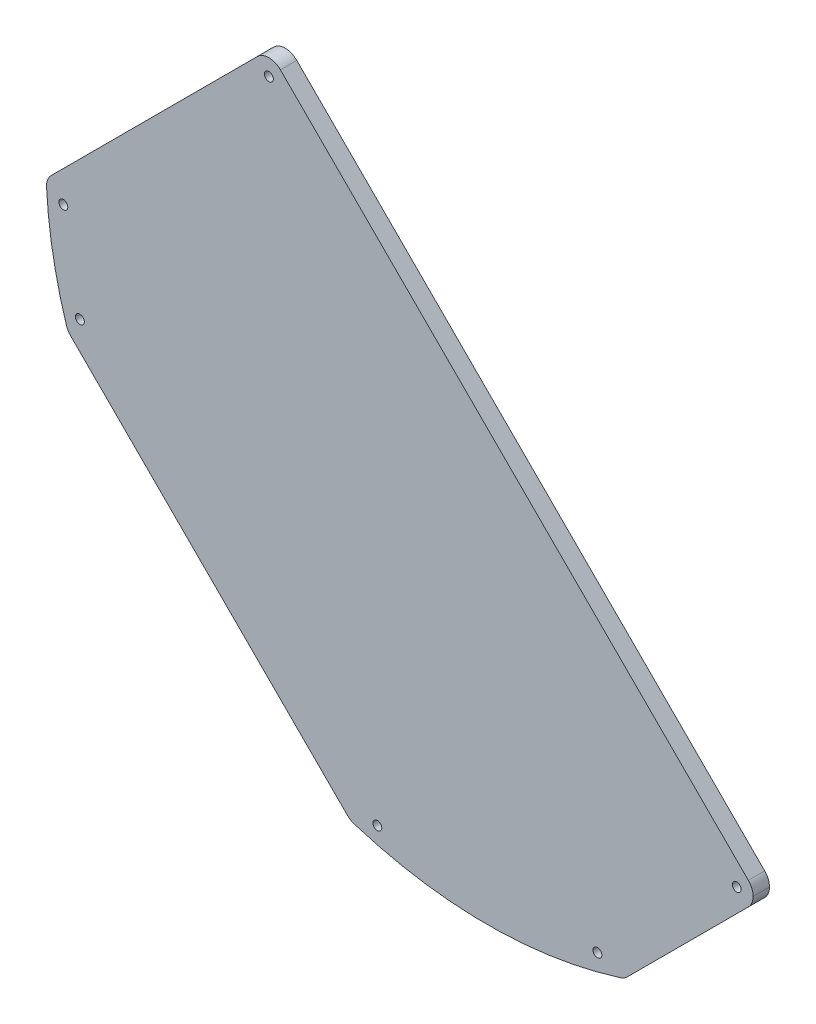
ISO-10303-21;
HEADER;
FILE_DESCRIPTION(('STEP AP214'),'2;1');
FILE_NAME('part.step','',(''),(''),'','','');
FILE_SCHEMA(('AUTOMOTIVE_DESIGN { 1 0 10303 214 1 1 1 1 }'));
ENDSEC;
DATA;
#1=APPLICATION_CONTEXT('core data for automotive mechanical design processes');
#2=APPLICATION_PROTOCOL_DEFINITION('international standard','automotive_design',2000,#1);
#3=PRODUCT_CONTEXT('',#1,'mechanical');
#4=PRODUCT('Part','Part','',(#3));
#5=PRODUCT_RELATED_PRODUCT_CATEGORY('part','',(#4));
#6=PRODUCT_DEFINITION_FORMATION('','',#4);
#7=PRODUCT_DEFINITION_CONTEXT('part definition',#1,'design');
#8=PRODUCT_DEFINITION('design','',#6,#7);
#9=PRODUCT_DEFINITION_SHAPE('','',#8);
#10=(LENGTH_UNIT() NAMED_UNIT(*) SI_UNIT(.MILLI.,.METRE.));
#11=(NAMED_UNIT(*) PLANE_ANGLE_UNIT() SI_UNIT($,.RADIAN.));
#12=(NAMED_UNIT(*) SI_UNIT($,.STERADIAN.) SOLID_ANGLE_UNIT());
#13=UNCERTAINTY_MEASURE_WITH_UNIT(LENGTH_MEASURE(1.E-05),#10,'distance_accuracy_value','');
#14=(GEOMETRIC_REPRESENTATION_CONTEXT(3) GLOBAL_UNCERTAINTY_ASSIGNED_CONTEXT((#13)) GLOBAL_UNIT_ASSIGNED_CONTEXT((#10,
#11,#12)) REPRESENTATION_CONTEXT('',''));
#15=CARTESIAN_POINT('',(0.,0.,0.));
#16=DIRECTION('',(0.,0.,1.));
#17=DIRECTION('',(1.,0.,0.));
#18=AXIS2_PLACEMENT_3D('',#15,#16,#17);
#19=CARTESIAN_POINT('',(-84.8634203441035,71.3930361624998,0.));
#20=DIRECTION('',(0.,0.,-1.));
#21=DIRECTION('',(-1.,0.,0.));
#22=AXIS2_PLACEMENT_3D('',#19,#20,#21);
#23=CYLINDRICAL_SURFACE('',#22,1.7272);
#24=DIRECTION('',(0.,0.,-1.));
#25=VECTOR('',#24,1.);
#26=CARTESIAN_POINT('',(-83.1362203441035,71.3930361624998,0.));
#27=LINE('',#26,#25);
#28=CARTESIAN_POINT('',(-83.1362203441035,71.3930361624998,6.35));
#29=VERTEX_POINT('',#28);
#30=CARTESIAN_POINT('',(-83.1362203441035,71.3930361624998,0.));
#31=VERTEX_POINT('',#30);
#32=EDGE_CURVE('E285',#29,#31,#27,.T.);
#33=ORIENTED_EDGE('',*,*,#32,.F.);
#34=CARTESIAN_POINT('',(-84.8634203441035,71.3930361624998,6.35));
#35=DIRECTION('',(0.,0.,1.));
#36=DIRECTION('',(1.,0.,0.));
#37=AXIS2_PLACEMENT_3D('',#34,#35,#36);
#38=CIRCLE('',#37,1.7272);
#39=CARTESIAN_POINT('',(-86.5906203441035,71.3930361624998,6.35));
#40=VERTEX_POINT('',#39);
#41=EDGE_CURVE('E126',#29,#40,#38,.T.);
#42=ORIENTED_EDGE('',*,*,#41,.T.);
#43=DIRECTION('',(0.,0.,-1.));
#44=VECTOR('',#43,1.);
#45=CARTESIAN_POINT('',(-86.5906203441035,71.3930361624998,0.));
#46=LINE('',#45,#44);
#47=CARTESIAN_POINT('',(-86.5906203441035,71.3930361624998,0.));
#48=VERTEX_POINT('',#47);
#49=EDGE_CURVE('E307',#40,#48,#46,.T.);
#50=ORIENTED_EDGE('',*,*,#49,.T.);
#51=CARTESIAN_POINT('',(-84.8634203441035,71.3930361624998,0.));
#52=DIRECTION('',(0.,0.,-1.));
#53=DIRECTION('',(-1.,0.,0.));
#54=AXIS2_PLACEMENT_3D('',#51,#52,#53);
#55=CIRCLE('',#54,1.7272);
#56=EDGE_CURVE('E233',#48,#31,#55,.T.);
#57=ORIENTED_EDGE('',*,*,#56,.T.);
#58=EDGE_LOOP('',(#33,#42,#50,#57));
#59=FACE_BOUND('',#58,.T.);
#60=ADVANCED_FACE('F15',(#59),#23,.F.);
#61=CARTESIAN_POINT('',(96.879003034094,-110.349387215698,0.));
#62=DIRECTION('',(0.,0.,-1.));
#63=DIRECTION('',(-1.,0.,0.));
#64=AXIS2_PLACEMENT_3D('',#61,#62,#63);
#65=CYLINDRICAL_SURFACE('',#64,1.7272);
#66=DIRECTION('',(0.,0.,-1.));
#67=VECTOR('',#66,1.);
#68=CARTESIAN_POINT('',(98.606203034094,-110.349387215698,0.));
#69=LINE('',#68,#67);
#70=CARTESIAN_POINT('',(98.606203034094,-110.349387215698,6.35));
#71=VERTEX_POINT('',#70);
#72=CARTESIAN_POINT('',(98.606203034094,-110.349387215698,0.));
#73=VERTEX_POINT('',#72);
#74=EDGE_CURVE('E312',#71,#73,#69,.T.);
#75=ORIENTED_EDGE('',*,*,#74,.F.);
#76=CARTESIAN_POINT('',(96.879003034094,-110.349387215698,6.35));
#77=DIRECTION('',(0.,0.,1.));
#78=DIRECTION('',(1.,0.,0.));
#79=AXIS2_PLACEMENT_3D('',#76,#77,#78);
#80=CIRCLE('',#79,1.7272);
#81=CARTESIAN_POINT('',(95.151803034094,-110.349387215698,6.35));
#82=VERTEX_POINT('',#81);
#83=EDGE_CURVE('E125',#71,#82,#80,.T.);
#84=ORIENTED_EDGE('',*,*,#83,.T.);
#85=DIRECTION('',(0.,0.,-1.));
#86=VECTOR('',#85,1.);
#87=CARTESIAN_POINT('',(95.151803034094,-110.349387215698,0.));
#88=LINE('',#87,#86);
#89=CARTESIAN_POINT('',(95.151803034094,-110.349387215698,0.));
#90=VERTEX_POINT('',#89);
#91=EDGE_CURVE('E335',#82,#90,#88,.T.);
#92=ORIENTED_EDGE('',*,*,#91,.T.);
#93=CARTESIAN_POINT('',(96.879003034094,-110.349387215698,0.));
#94=DIRECTION('',(0.,0.,-1.));
#95=DIRECTION('',(-1.,0.,0.));
#96=AXIS2_PLACEMENT_3D('',#93,#94,#95);
#97=CIRCLE('',#96,1.7272);
#98=EDGE_CURVE('E224',#90,#73,#97,.T.);
#99=ORIENTED_EDGE('',*,*,#98,.T.);
#100=EDGE_LOOP('',(#75,#84,#92,#99));
#101=FACE_BOUND('',#100,.T.);
#102=ADVANCED_FACE('F500',(#101),#65,.F.);
#103=CARTESIAN_POINT('',(-164.69199269842,-11.5998940091604,0.));
#104=DIRECTION('',(0.,0.,-1.));
#105=DIRECTION('',(-1.,0.,0.));
#106=AXIS2_PLACEMENT_3D('',#103,#104,#105);
#107=CYLINDRICAL_SURFACE('',#106,1.7272);
#108=DIRECTION('',(0.,0.,-1.));
#109=VECTOR('',#108,1.);
#110=CARTESIAN_POINT('',(-162.964792698419,-11.5998940091604,0.));
#111=LINE('',#110,#109);
#112=CARTESIAN_POINT('',(-162.964792698419,-11.5998940091604,6.35));
#113=VERTEX_POINT('',#112);
#114=CARTESIAN_POINT('',(-162.964792698419,-11.5998940091604,0.));
#115=VERTEX_POINT('',#114);
#116=EDGE_CURVE('E319',#113,#115,#111,.T.);
#117=ORIENTED_EDGE('',*,*,#116,.F.);
#118=CARTESIAN_POINT('',(-164.69199269842,-11.5998940091604,6.35));
#119=DIRECTION('',(0.,0.,1.));
#120=DIRECTION('',(1.,0.,0.));
#121=AXIS2_PLACEMENT_3D('',#118,#119,#120);
#122=CIRCLE('',#121,1.7272);
#123=CARTESIAN_POINT('',(-166.419192698419,-11.5998940091604,6.35));
#124=VERTEX_POINT('',#123);
#125=EDGE_CURVE('E130',#113,#124,#122,.T.);
#126=ORIENTED_EDGE('',*,*,#125,.T.);
#127=DIRECTION('',(0.,0.,-1.));
#128=VECTOR('',#127,1.);
#129=CARTESIAN_POINT('',(-166.419192698419,-11.5998940091604,0.));
#130=LINE('',#129,#128);
#131=CARTESIAN_POINT('',(-166.419192698419,-11.5998940091604,0.));
#132=VERTEX_POINT('',#131);
#133=EDGE_CURVE('E294',#124,#132,#130,.T.);
#134=ORIENTED_EDGE('',*,*,#133,.T.);
#135=CARTESIAN_POINT('',(-164.69199269842,-11.5998940091604,0.));
#136=DIRECTION('',(0.,0.,-1.));
#137=DIRECTION('',(-1.,0.,0.));
#138=AXIS2_PLACEMENT_3D('',#135,#136,#137);
#139=CIRCLE('',#138,1.7272);
#140=EDGE_CURVE('E218',#132,#115,#139,.T.);
#141=ORIENTED_EDGE('',*,*,#140,.T.);
#142=EDGE_LOOP('',(#117,#126,#134,#141));
#143=FACE_BOUND('',#142,.T.);
#144=ADVANCED_FACE('F502',(#143),#107,.F.);
#145=CARTESIAN_POINT('',(-158.277458295027,-46.9708015224995,0.));
#146=DIRECTION('',(0.,0.,-1.));
#147=DIRECTION('',(-1.,0.,0.));
#148=AXIS2_PLACEMENT_3D('',#145,#146,#147);
#149=CYLINDRICAL_SURFACE('',#148,1.7272);
#150=DIRECTION('',(0.,0.,-1.));
#151=VECTOR('',#150,1.);
#152=CARTESIAN_POINT('',(-156.550258295027,-46.9708015224995,0.));
#153=LINE('',#152,#151);
#154=CARTESIAN_POINT('',(-156.550258295027,-46.9708015224995,6.35));
#155=VERTEX_POINT('',#154);
#156=CARTESIAN_POINT('',(-156.550258295027,-46.9708015224995,0.));
#157=VERTEX_POINT('',#156);
#158=EDGE_CURVE('E292',#155,#157,#153,.T.);
#159=ORIENTED_EDGE('',*,*,#158,.F.);
#160=CARTESIAN_POINT('',(-158.277458295027,-46.9708015224995,6.35));
#161=DIRECTION('',(0.,0.,1.));
#162=DIRECTION('',(1.,0.,0.));
#163=AXIS2_PLACEMENT_3D('',#160,#161,#162);
#164=CIRCLE('',#163,1.7272);
#165=CARTESIAN_POINT('',(-160.004658295027,-46.9708015224995,6.35));
#166=VERTEX_POINT('',#165);
#167=EDGE_CURVE('E128',#155,#166,#164,.T.);
#168=ORIENTED_EDGE('',*,*,#167,.T.);
#169=DIRECTION('',(0.,0.,-1.));
#170=VECTOR('',#169,1.);
#171=CARTESIAN_POINT('',(-160.004658295027,-46.9708015224995,0.));
#172=LINE('',#171,#170);
#173=CARTESIAN_POINT('',(-160.004658295027,-46.9708015224995,0.));
#174=VERTEX_POINT('',#173);
#175=EDGE_CURVE('E299',#166,#174,#172,.T.);
#176=ORIENTED_EDGE('',*,*,#175,.T.);
#177=CARTESIAN_POINT('',(-158.277458295027,-46.9708015224995,0.));
#178=DIRECTION('',(0.,0.,-1.));
#179=DIRECTION('',(-1.,0.,0.));
#180=AXIS2_PLACEMENT_3D('',#177,#178,#179);
#181=CIRCLE('',#180,1.7272);
#182=EDGE_CURVE('E210',#174,#157,#181,.T.);
#183=ORIENTED_EDGE('',*,*,#182,.T.);
#184=EDGE_LOOP('',(#159,#168,#176,#183));
#185=FACE_BOUND('',#184,.T.);
#186=ADVANCED_FACE('F825',(#185),#149,.F.);
#187=CARTESIAN_POINT('',(42.7310243464256,-159.474353920325,0.));
#188=DIRECTION('',(0.,0.,-1.));
#189=DIRECTION('',(-1.,0.,0.));
#190=AXIS2_PLACEMENT_3D('',#187,#188,#189);
#191=CYLINDRICAL_SURFACE('',#190,1.7272);
#192=DIRECTION('',(0.,0.,-1.));
#193=VECTOR('',#192,1.);
#194=CARTESIAN_POINT('',(44.4582243464257,-159.474353920325,0.));
#195=LINE('',#194,#193);
#196=CARTESIAN_POINT('',(44.4582243464257,-159.474353920325,6.35));
#197=VERTEX_POINT('',#196);
#198=CARTESIAN_POINT('',(44.4582243464257,-159.474353920325,0.));
#199=VERTEX_POINT('',#198);
#200=EDGE_CURVE('E354',#197,#199,#195,.T.);
#201=ORIENTED_EDGE('',*,*,#200,.F.);
#202=CARTESIAN_POINT('',(42.7310243464256,-159.474353920325,6.35));
#203=DIRECTION('',(0.,0.,1.));
#204=DIRECTION('',(1.,0.,0.));
#205=AXIS2_PLACEMENT_3D('',#202,#203,#204);
#206=CIRCLE('',#205,1.7272);
#207=CARTESIAN_POINT('',(41.0038243464256,-159.474353920325,6.35));
#208=VERTEX_POINT('',#207);
#209=EDGE_CURVE('E135',#197,#208,#206,.T.);
#210=ORIENTED_EDGE('',*,*,#209,.T.);
#211=DIRECTION('',(0.,0.,-1.));
#212=VECTOR('',#211,1.);
#213=CARTESIAN_POINT('',(41.0038243464256,-159.474353920325,0.));
#214=LINE('',#213,#212);
#215=CARTESIAN_POINT('',(41.0038243464256,-159.474353920325,0.));
#216=VERTEX_POINT('',#215);
#217=EDGE_CURVE('E361',#208,#216,#214,.T.);
#218=ORIENTED_EDGE('',*,*,#217,.T.);
#219=CARTESIAN_POINT('',(42.7310243464256,-159.474353920325,0.));
#220=DIRECTION('',(0.,0.,-1.));
#221=DIRECTION('',(-1.,0.,0.));
#222=AXIS2_PLACEMENT_3D('',#219,#220,#221);
#223=CIRCLE('',#222,1.7272);
#224=EDGE_CURVE('E214',#216,#199,#223,.T.);
#225=ORIENTED_EDGE('',*,*,#224,.T.);
#226=EDGE_LOOP('',(#201,#210,#218,#225));
#227=FACE_BOUND('',#226,.T.);
#228=ADVANCED_FACE('F495',(#227),#191,.F.);
#229=CARTESIAN_POINT('',(-42.7310243464257,-159.474353920325,0.));
#230=DIRECTION('',(0.,0.,-1.));
#231=DIRECTION('',(-1.,0.,0.));
#232=AXIS2_PLACEMENT_3D('',#229,#230,#231);
#233=CYLINDRICAL_SURFACE('',#232,1.7272);
#234=DIRECTION('',(0.,0.,-1.));
#235=VECTOR('',#234,1.);
#236=CARTESIAN_POINT('',(-41.0038243464257,-159.474353920325,0.));
#237=LINE('',#236,#235);
#238=CARTESIAN_POINT('',(-41.0038243464257,-159.474353920325,6.35));
#239=VERTEX_POINT('',#238);
#240=CARTESIAN_POINT('',(-41.0038243464257,-159.474353920325,0.));
#241=VERTEX_POINT('',#240);
#242=EDGE_CURVE('E371',#239,#241,#237,.T.);
#243=ORIENTED_EDGE('',*,*,#242,.F.);
#244=CARTESIAN_POINT('',(-42.7310243464257,-159.474353920325,6.35));
#245=DIRECTION('',(0.,0.,1.));
#246=DIRECTION('',(1.,0.,0.));
#247=AXIS2_PLACEMENT_3D('',#244,#245,#246);
#248=CIRCLE('',#247,1.7272);
#249=CARTESIAN_POINT('',(-44.4582243464257,-159.474353920325,6.35));
#250=VERTEX_POINT('',#249);
#251=EDGE_CURVE('E87',#239,#250,#248,.T.);
#252=ORIENTED_EDGE('',*,*,#251,.T.);
#253=DIRECTION('',(0.,0.,-1.));
#254=VECTOR('',#253,1.);
#255=CARTESIAN_POINT('',(-44.4582243464257,-159.474353920325,0.));
#256=LINE('',#255,#254);
#257=CARTESIAN_POINT('',(-44.4582243464257,-159.474353920325,0.));
#258=VERTEX_POINT('',#257);
#259=EDGE_CURVE('E338',#250,#258,#256,.T.);
#260=ORIENTED_EDGE('',*,*,#259,.T.);
#261=CARTESIAN_POINT('',(-42.7310243464257,-159.474353920325,0.));
#262=DIRECTION('',(0.,0.,-1.));
#263=DIRECTION('',(-1.,0.,0.));
#264=AXIS2_PLACEMENT_3D('',#261,#262,#263);
#265=CIRCLE('',#264,1.7272);
#266=EDGE_CURVE('E211',#258,#241,#265,.T.);
#267=ORIENTED_EDGE('',*,*,#266,.T.);
#268=EDGE_LOOP('',(#243,#252,#260,#267));
#269=FACE_BOUND('',#268,.T.);
#270=ADVANCED_FACE('F482',(#269),#233,.F.);
#271=CARTESIAN_POINT('',(-84.8634203441035,71.3930361624998,0.));
#272=DIRECTION('',(0.,0.,1.));
#273=DIRECTION('',(1.,0.,0.));
#274=AXIS2_PLACEMENT_3D('',#271,#272,#273);
#275=CYLINDRICAL_SURFACE('',#274,6.35);
#276=CARTESIAN_POINT('',(-84.8634203441035,71.3930361624998,0.));
#277=DIRECTION('',(0.,0.,-1.));
#278=DIRECTION('',(1.,0.,0.));
#279=AXIS2_PLACEMENT_3D('',#276,#277,#278);
#280=CIRCLE('',#279,6.35);
#281=CARTESIAN_POINT('',(-89.3535484046381,75.8831642230343,0.));
#282=VERTEX_POINT('',#281);
#283=CARTESIAN_POINT('',(-80.3732922835689,75.8831642230343,0.));
#284=VERTEX_POINT('',#283);
#285=EDGE_CURVE('E174',#282,#284,#280,.T.);
#286=ORIENTED_EDGE('',*,*,#285,.F.);
#287=DIRECTION('',(0.,0.,-1.));
#288=VECTOR('',#287,1.);
#289=CARTESIAN_POINT('',(-89.3535484046381,75.8831642230343,6.35));
#290=LINE('',#289,#288);
#291=CARTESIAN_POINT('',(-89.3535484046381,75.8831642230343,6.35));
#292=VERTEX_POINT('',#291);
#293=EDGE_CURVE('E230',#292,#282,#290,.T.);
#294=ORIENTED_EDGE('',*,*,#293,.F.);
#295=CARTESIAN_POINT('',(-84.8634203441035,71.3930361624998,6.35));
#296=DIRECTION('',(0.,0.,1.));
#297=DIRECTION('',(1.,0.,0.));
#298=AXIS2_PLACEMENT_3D('',#295,#296,#297);
#299=CIRCLE('',#298,6.35);
#300=CARTESIAN_POINT('',(-80.3732922835689,75.8831642230343,6.35));
#301=VERTEX_POINT('',#300);
#302=EDGE_CURVE('E194',#301,#292,#299,.T.);
#303=ORIENTED_EDGE('',*,*,#302,.F.);
#304=DIRECTION('',(0.,0.,1.));
#305=VECTOR('',#304,1.);
#306=CARTESIAN_POINT('',(-80.3732922835689,75.8831642230343,0.));
#307=LINE('',#306,#305);
#308=EDGE_CURVE('E9',#284,#301,#307,.T.);
#309=ORIENTED_EDGE('',*,*,#308,.F.);
#310=EDGE_LOOP('',(#286,#294,#303,#309));
#311=FACE_BOUND('',#310,.T.);
#312=ADVANCED_FACE('F485',(#311),#275,.T.);
#313=CARTESIAN_POINT('',(96.879003034094,-110.349387215698,0.));
#314=DIRECTION('',(0.,0.,1.));
#315=DIRECTION('',(1.,0.,0.));
#316=AXIS2_PLACEMENT_3D('',#313,#314,#315);
#317=CYLINDRICAL_SURFACE('',#316,6.35);
#318=DIRECTION('',(0.,0.,1.));
#319=VECTOR('',#318,1.);
#320=CARTESIAN_POINT('',(103.229003034094,-110.349387215698,0.));
#321=LINE('',#320,#319);
#322=CARTESIAN_POINT('',(103.229003034094,-110.349387215698,0.));
#323=VERTEX_POINT('',#322);
#324=CARTESIAN_POINT('',(103.229003034094,-110.349387215698,6.35));
#325=VERTEX_POINT('',#324);
#326=EDGE_CURVE('E165',#323,#325,#321,.T.);
#327=ORIENTED_EDGE('',*,*,#326,.F.);
#328=CARTESIAN_POINT('',(96.879003034094,-110.349387215698,0.));
#329=DIRECTION('',(0.,0.,-1.));
#330=DIRECTION('',(1.,0.,0.));
#331=AXIS2_PLACEMENT_3D('',#328,#329,#330);
#332=CIRCLE('',#331,6.35);
#333=CARTESIAN_POINT('',(101.369131094629,-105.859259155163,0.));
#334=VERTEX_POINT('',#333);
#335=EDGE_CURVE('E158',#334,#323,#332,.T.);
#336=ORIENTED_EDGE('',*,*,#335,.F.);
#337=DIRECTION('',(0.,0.,-1.));
#338=VECTOR('',#337,1.);
#339=CARTESIAN_POINT('',(101.369131094629,-105.859259155163,0.));
#340=LINE('',#339,#338);
#341=CARTESIAN_POINT('',(101.369131094629,-105.859259155163,6.35));
#342=VERTEX_POINT('',#341);
#343=EDGE_CURVE('E24',#342,#334,#340,.T.);
#344=ORIENTED_EDGE('',*,*,#343,.F.);
#345=CARTESIAN_POINT('',(96.879003034094,-110.349387215698,6.35));
#346=DIRECTION('',(0.,0.,1.));
#347=DIRECTION('',(1.,0.,0.));
#348=AXIS2_PLACEMENT_3D('',#345,#346,#347);
#349=CIRCLE('',#348,6.35);
#350=EDGE_CURVE('E99',#325,#342,#349,.T.);
#351=ORIENTED_EDGE('',*,*,#350,.F.);
#352=EDGE_LOOP('',(#327,#336,#344,#351));
#353=FACE_BOUND('',#352,.T.);
#354=ADVANCED_FACE('F157',(#353),#317,.T.);
#355=CARTESIAN_POINT('',(49.8266169249063,-157.401773324886,6.35));
#356=DIRECTION('',(0.,0.,-1.));
#357=DIRECTION('',(-1.,0.,0.));
#358=AXIS2_PLACEMENT_3D('',#355,#356,#357);
#359=CYLINDRICAL_SURFACE('',#358,6.35);
#360=CARTESIAN_POINT('',(49.8266169249063,-157.401773324886,0.));
#361=DIRECTION('',(0.,0.,-1.));
#362=DIRECTION('',(1.,0.,0.));
#363=AXIS2_PLACEMENT_3D('',#360,#361,#362);
#364=CIRCLE('',#363,6.35);
#365=CARTESIAN_POINT('',(54.3167449854409,-161.89190138542,0.));
#366=VERTEX_POINT('',#365);
#367=CARTESIAN_POINT('',(51.7430252681719,-163.455687683535,0.));
#368=VERTEX_POINT('',#367);
#369=EDGE_CURVE('E81',#366,#368,#364,.T.);
#370=ORIENTED_EDGE('',*,*,#369,.F.);
#371=DIRECTION('',(0.,0.,-1.));
#372=VECTOR('',#371,1.);
#373=CARTESIAN_POINT('',(54.3167449854409,-161.89190138542,0.));
#374=LINE('',#373,#372);
#375=CARTESIAN_POINT('',(54.3167449854409,-161.89190138542,6.35));
#376=VERTEX_POINT('',#375);
#377=EDGE_CURVE('E75',#376,#366,#374,.T.);
#378=ORIENTED_EDGE('',*,*,#377,.F.);
#379=CARTESIAN_POINT('',(49.8266169249063,-157.401773324886,6.35));
#380=DIRECTION('',(0.,0.,1.));
#381=DIRECTION('',(1.,0.,0.));
#382=AXIS2_PLACEMENT_3D('',#379,#380,#381);
#383=CIRCLE('',#382,6.35);
#384=CARTESIAN_POINT('',(51.7430252681719,-163.455687683535,6.35));
#385=VERTEX_POINT('',#384);
#386=EDGE_CURVE('E80',#385,#376,#383,.T.);
#387=ORIENTED_EDGE('',*,*,#386,.F.);
#388=DIRECTION('',(0.,0.,1.));
#389=VECTOR('',#388,1.);
#390=CARTESIAN_POINT('',(51.7430252681719,-163.455687683535,6.35));
#391=LINE('',#390,#389);
#392=EDGE_CURVE('E242',#368,#385,#391,.T.);
#393=ORIENTED_EDGE('',*,*,#392,.F.);
#394=EDGE_LOOP('',(#370,#378,#387,#393));
#395=FACE_BOUND('',#394,.T.);
#396=ADVANCED_FACE('F73',(#395),#359,.T.);
#397=CARTESIAN_POINT('',(-49.8266169249062,-157.401773324886,6.35));
#398=DIRECTION('',(0.,0.,-1.));
#399=DIRECTION('',(-1.,0.,0.));
#400=AXIS2_PLACEMENT_3D('',#397,#398,#399);
#401=CYLINDRICAL_SURFACE('',#400,6.35);
#402=CARTESIAN_POINT('',(-49.8266169249062,-157.401773324886,0.));
#403=DIRECTION('',(0.,0.,-1.));
#404=DIRECTION('',(1.,0.,0.));
#405=AXIS2_PLACEMENT_3D('',#402,#403,#404);
#406=CIRCLE('',#405,6.35);
#407=CARTESIAN_POINT('',(-51.7430252681718,-163.455687683535,0.));
#408=VERTEX_POINT('',#407);
#409=CARTESIAN_POINT('',(-54.3167449854408,-161.89190138542,0.));
#410=VERTEX_POINT('',#409);
#411=EDGE_CURVE('E191',#408,#410,#406,.T.);
#412=ORIENTED_EDGE('',*,*,#411,.F.);
#413=DIRECTION('',(0.,0.,-1.));
#414=VECTOR('',#413,1.);
#415=CARTESIAN_POINT('',(-51.7430252681718,-163.455687683535,6.35));
#416=LINE('',#415,#414);
#417=CARTESIAN_POINT('',(-51.7430252681718,-163.455687683535,6.35));
#418=VERTEX_POINT('',#417);
#419=EDGE_CURVE('E250',#418,#408,#416,.T.);
#420=ORIENTED_EDGE('',*,*,#419,.F.);
#421=CARTESIAN_POINT('',(-49.8266169249062,-157.401773324886,6.35));
#422=DIRECTION('',(0.,0.,1.));
#423=DIRECTION('',(1.,0.,0.));
#424=AXIS2_PLACEMENT_3D('',#421,#422,#423);
#425=CIRCLE('',#424,6.35);
#426=CARTESIAN_POINT('',(-54.3167449854408,-161.89190138542,6.35));
#427=VERTEX_POINT('',#426);
#428=EDGE_CURVE('E108',#427,#418,#425,.T.);
#429=ORIENTED_EDGE('',*,*,#428,.F.);
#430=DIRECTION('',(0.,0.,1.));
#431=VECTOR('',#430,1.);
#432=CARTESIAN_POINT('',(-54.3167449854408,-161.89190138542,0.));
#433=LINE('',#432,#431);
#434=EDGE_CURVE('E61',#410,#427,#433,.T.);
#435=ORIENTED_EDGE('',*,*,#434,.F.);
#436=EDGE_LOOP('',(#412,#420,#429,#435));
#437=FACE_BOUND('',#436,.T.);
#438=ADVANCED_FACE('F854',(#437),#401,.T.);
#439=CARTESIAN_POINT('',(-157.401773324886,-49.8266169249063,6.35));
#440=DIRECTION('',(0.,0.,-1.));
#441=DIRECTION('',(-1.,0.,0.));
#442=AXIS2_PLACEMENT_3D('',#439,#440,#441);
#443=CYLINDRICAL_SURFACE('',#442,6.35);
#444=CARTESIAN_POINT('',(-157.401773324886,-49.8266169249063,0.));
#445=DIRECTION('',(0.,0.,-1.));
#446=DIRECTION('',(1.,0.,0.));
#447=AXIS2_PLACEMENT_3D('',#444,#445,#446);
#448=CIRCLE('',#447,6.35);
#449=CARTESIAN_POINT('',(-161.89190138542,-54.3167449854409,0.));
#450=VERTEX_POINT('',#449);
#451=CARTESIAN_POINT('',(-163.455687683535,-51.7430252681719,0.));
#452=VERTEX_POINT('',#451);
#453=EDGE_CURVE('E201',#450,#452,#448,.T.);
#454=ORIENTED_EDGE('',*,*,#453,.F.);
#455=DIRECTION('',(0.,0.,-1.));
#456=VECTOR('',#455,1.);
#457=CARTESIAN_POINT('',(-161.89190138542,-54.3167449854409,0.));
#458=LINE('',#457,#456);
#459=CARTESIAN_POINT('',(-161.89190138542,-54.3167449854409,6.35));
#460=VERTEX_POINT('',#459);
#461=EDGE_CURVE('E88',#460,#450,#458,.T.);
#462=ORIENTED_EDGE('',*,*,#461,.F.);
#463=CARTESIAN_POINT('',(-157.401773324886,-49.8266169249063,6.35));
#464=DIRECTION('',(0.,0.,1.));
#465=DIRECTION('',(1.,0.,0.));
#466=AXIS2_PLACEMENT_3D('',#463,#464,#465);
#467=CIRCLE('',#466,6.35);
#468=CARTESIAN_POINT('',(-163.455687683535,-51.7430252681719,6.35));
#469=VERTEX_POINT('',#468);
#470=EDGE_CURVE('E245',#469,#460,#467,.T.);
#471=ORIENTED_EDGE('',*,*,#470,.F.);
#472=DIRECTION('',(0.,0.,1.));
#473=VECTOR('',#472,1.);
#474=CARTESIAN_POINT('',(-163.455687683535,-51.7430252681719,6.35));
#475=LINE('',#474,#473);
#476=EDGE_CURVE('E261',#452,#469,#475,.T.);
#477=ORIENTED_EDGE('',*,*,#476,.F.);
#478=EDGE_LOOP('',(#454,#462,#471,#477));
#479=FACE_BOUND('',#478,.T.);
#480=ADVANCED_FACE('F861',(#479),#443,.T.);
#481=CARTESIAN_POINT('',(-164.874899370987,-8.61844286438453,6.35));
#482=DIRECTION('',(0.,0.,-1.));
#483=DIRECTION('',(-1.,0.,0.));
#484=AXIS2_PLACEMENT_3D('',#481,#482,#483);
#485=CYLINDRICAL_SURFACE('',#484,6.35);
#486=DIRECTION('',(0.,0.,-1.));
#487=VECTOR('',#486,1.);
#488=CARTESIAN_POINT('',(-171.224899370988,-8.61844286438453,6.35));
#489=LINE('',#488,#487);
#490=CARTESIAN_POINT('',(-171.224899370988,-8.61844286438453,6.35));
#491=VERTEX_POINT('',#490);
#492=CARTESIAN_POINT('',(-171.224899370988,-8.61844286438453,0.));
#493=VERTEX_POINT('',#492);
#494=EDGE_CURVE('E391',#491,#493,#489,.T.);
#495=ORIENTED_EDGE('',*,*,#494,.F.);
#496=CARTESIAN_POINT('',(-164.874899370987,-8.61844286438453,6.35));
#497=DIRECTION('',(0.,0.,1.));
#498=DIRECTION('',(1.,0.,0.));
#499=AXIS2_PLACEMENT_3D('',#496,#497,#498);
#500=CIRCLE('',#499,6.35);
#501=CARTESIAN_POINT('',(-169.365027431523,-4.12831480384992,6.35));
#502=VERTEX_POINT('',#501);
#503=EDGE_CURVE('E238',#502,#491,#500,.T.);
#504=ORIENTED_EDGE('',*,*,#503,.F.);
#505=DIRECTION('',(0.,0.,1.));
#506=VECTOR('',#505,1.);
#507=CARTESIAN_POINT('',(-169.365027431523,-4.12831480384992,6.35));
#508=LINE('',#507,#506);
#509=CARTESIAN_POINT('',(-169.365027431523,-4.12831480384992,0.));
#510=VERTEX_POINT('',#509);
#511=EDGE_CURVE('E232',#510,#502,#508,.T.);
#512=ORIENTED_EDGE('',*,*,#511,.F.);
#513=CARTESIAN_POINT('',(-164.874899370987,-8.61844286438453,0.));
#514=DIRECTION('',(0.,0.,-1.));
#515=DIRECTION('',(1.,0.,0.));
#516=AXIS2_PLACEMENT_3D('',#513,#514,#515);
#517=CIRCLE('',#516,6.35);
#518=EDGE_CURVE('E410',#493,#510,#517,.T.);
#519=ORIENTED_EDGE('',*,*,#518,.F.);
#520=EDGE_LOOP('',(#495,#504,#512,#519));
#521=FACE_BOUND('',#520,.T.);
#522=ADVANCED_FACE('F435',(#521),#485,.T.);
#523=CARTESIAN_POINT('',(-84.8634203441035,80.3732922835689,0.));
#524=DIRECTION('',(-0.707106781186548,-0.707106781186548,0.));
#525=DIRECTION('',(-0.707106781186548,0.707106781186548,0.));
#526=AXIS2_PLACEMENT_3D('',#523,#524,#525);
#527=PLANE('',#526);
#528=DIRECTION('',(0.707106781186548,-0.707106781186548,0.));
#529=VECTOR('',#528,1.);
#530=CARTESIAN_POINT('',(-84.8634203441035,80.3732922835689,6.35));
#531=LINE('',#530,#529);
#532=EDGE_CURVE('E122',#301,#342,#531,.T.);
#533=ORIENTED_EDGE('',*,*,#532,.T.);
#534=ORIENTED_EDGE('',*,*,#343,.T.);
#535=DIRECTION('',(0.707106781186548,-0.707106781186548,0.));
#536=VECTOR('',#535,1.);
#537=CARTESIAN_POINT('',(-84.8634203441035,80.3732922835689,0.));
#538=LINE('',#537,#536);
#539=EDGE_CURVE('E149',#284,#334,#538,.T.);
#540=ORIENTED_EDGE('',*,*,#539,.F.);
#541=ORIENTED_EDGE('',*,*,#308,.T.);
#542=EDGE_LOOP('',(#533,#534,#540,#541));
#543=FACE_BOUND('',#542,.T.);
#544=ADVANCED_FACE('F148',(#543),#527,.F.);
#545=CARTESIAN_POINT('',(-162.976962620945,-53.2316837499159,0.));
#546=DIRECTION('',(0.707106781186547,0.707106781186548,0.));
#547=DIRECTION('',(0.,0.,-1.));
#548=AXIS2_PLACEMENT_3D('',#545,#546,#547);
#549=PLANE('',#548);
#550=DIRECTION('',(-0.707106781186548,0.707106781186547,0.));
#551=VECTOR('',#550,1.);
#552=CARTESIAN_POINT('',(-162.976962620945,-53.2316837499159,6.35));
#553=LINE('',#552,#551);
#554=EDGE_CURVE('E111',#427,#460,#553,.T.);
#555=ORIENTED_EDGE('',*,*,#554,.T.);
#556=ORIENTED_EDGE('',*,*,#461,.T.);
#557=DIRECTION('',(-0.707106781186548,0.707106781186547,0.));
#558=VECTOR('',#557,1.);
#559=CARTESIAN_POINT('',(-162.976962620945,-53.2316837499159,0.));
#560=LINE('',#559,#558);
#561=EDGE_CURVE('E200',#410,#450,#560,.T.);
#562=ORIENTED_EDGE('',*,*,#561,.F.);
#563=ORIENTED_EDGE('',*,*,#434,.T.);
#564=EDGE_LOOP('',(#555,#556,#562,#563));
#565=FACE_BOUND('',#564,.T.);
#566=ADVANCED_FACE('F892',(#565),#549,.F.);
#567=CARTESIAN_POINT('',(53.2316837499159,-162.976962620945,0.));
#568=DIRECTION('',(-0.707106781186548,0.707106781186547,0.));
#569=DIRECTION('',(0.,0.,1.));
#570=AXIS2_PLACEMENT_3D('',#567,#568,#569);
#571=PLANE('',#570);
#572=DIRECTION('',(-0.707106781186547,-0.707106781186548,0.));
#573=VECTOR('',#572,1.);
#574=CARTESIAN_POINT('',(53.2316837499159,-162.976962620945,6.35));
#575=LINE('',#574,#573);
#576=CARTESIAN_POINT('',(101.369131094629,-114.839515276232,6.35));
#577=VERTEX_POINT('',#576);
#578=EDGE_CURVE('E93',#577,#376,#575,.T.);
#579=ORIENTED_EDGE('',*,*,#578,.T.);
#580=ORIENTED_EDGE('',*,*,#377,.T.);
#581=DIRECTION('',(-0.707106781186547,-0.707106781186548,0.));
#582=VECTOR('',#581,1.);
#583=CARTESIAN_POINT('',(53.2316837499159,-162.976962620945,0.));
#584=LINE('',#583,#582);
#585=CARTESIAN_POINT('',(101.369131094629,-114.839515276232,0.));
#586=VERTEX_POINT('',#585);
#587=EDGE_CURVE('E170',#586,#366,#584,.T.);
#588=ORIENTED_EDGE('',*,*,#587,.F.);
#589=DIRECTION('',(0.,0.,1.));
#590=VECTOR('',#589,1.);
#591=CARTESIAN_POINT('',(101.369131094629,-114.839515276232,0.));
#592=LINE('',#591,#590);
#593=EDGE_CURVE('E92',#586,#577,#592,.T.);
#594=ORIENTED_EDGE('',*,*,#593,.T.);
#595=EDGE_LOOP('',(#579,#580,#588,#594));
#596=FACE_BOUND('',#595,.T.);
#597=ADVANCED_FACE('F95',(#596),#571,.F.);
#598=CARTESIAN_POINT('',(0.,0.,6.35));
#599=DIRECTION('',(0.,0.,1.));
#600=DIRECTION('',(1.,0.,0.));
#601=AXIS2_PLACEMENT_3D('',#598,#599,#600);
#602=PLANE('',#601);
#603=CARTESIAN_POINT('',(-42.7310243464257,-159.474353920325,6.35));
#604=DIRECTION('',(0.,0.,1.));
#605=DIRECTION('',(1.,0.,0.));
#606=AXIS2_PLACEMENT_3D('',#603,#604,#605);
#607=CIRCLE('',#606,1.7272);
#608=EDGE_CURVE('E370',#250,#239,#607,.T.);
#609=ORIENTED_EDGE('',*,*,#608,.F.);
#610=ORIENTED_EDGE('',*,*,#251,.F.);
#611=EDGE_LOOP('',(#609,#610));
#612=FACE_BOUND('',#611,.T.);
#613=CARTESIAN_POINT('',(42.7310243464256,-159.474353920325,6.35));
#614=DIRECTION('',(0.,0.,1.));
#615=DIRECTION('',(1.,0.,0.));
#616=AXIS2_PLACEMENT_3D('',#613,#614,#615);
#617=CIRCLE('',#616,1.7272);
#618=EDGE_CURVE('E351',#208,#197,#617,.T.);
#619=ORIENTED_EDGE('',*,*,#618,.F.);
#620=ORIENTED_EDGE('',*,*,#209,.F.);
#621=EDGE_LOOP('',(#619,#620));
#622=FACE_BOUND('',#621,.T.);
#623=CARTESIAN_POINT('',(-158.277458295027,-46.9708015224995,6.35));
#624=DIRECTION('',(0.,0.,1.));
#625=DIRECTION('',(1.,0.,0.));
#626=AXIS2_PLACEMENT_3D('',#623,#624,#625);
#627=CIRCLE('',#626,1.7272);
#628=EDGE_CURVE('E288',#166,#155,#627,.T.);
#629=ORIENTED_EDGE('',*,*,#628,.F.);
#630=ORIENTED_EDGE('',*,*,#167,.F.);
#631=EDGE_LOOP('',(#629,#630));
#632=FACE_BOUND('',#631,.T.);
#633=CARTESIAN_POINT('',(-164.69199269842,-11.5998940091604,6.35));
#634=DIRECTION('',(0.,0.,1.));
#635=DIRECTION('',(1.,0.,0.));
#636=AXIS2_PLACEMENT_3D('',#633,#634,#635);
#637=CIRCLE('',#636,1.7272);
#638=EDGE_CURVE('E324',#124,#113,#637,.T.);
#639=ORIENTED_EDGE('',*,*,#638,.F.);
#640=ORIENTED_EDGE('',*,*,#125,.F.);
#641=EDGE_LOOP('',(#639,#640));
#642=FACE_BOUND('',#641,.T.);
#643=CARTESIAN_POINT('',(96.879003034094,-110.349387215698,6.35));
#644=DIRECTION('',(0.,0.,1.));
#645=DIRECTION('',(1.,0.,0.));
#646=AXIS2_PLACEMENT_3D('',#643,#644,#645);
#647=CIRCLE('',#646,1.7272);
#648=EDGE_CURVE('E313',#82,#71,#647,.T.);
#649=ORIENTED_EDGE('',*,*,#648,.F.);
#650=ORIENTED_EDGE('',*,*,#83,.F.);
#651=EDGE_LOOP('',(#649,#650));
#652=FACE_BOUND('',#651,.T.);
#653=CARTESIAN_POINT('',(-84.8634203441035,71.3930361624998,6.35));
#654=DIRECTION('',(0.,0.,1.));
#655=DIRECTION('',(1.,0.,0.));
#656=AXIS2_PLACEMENT_3D('',#653,#654,#655);
#657=CIRCLE('',#656,1.7272);
#658=EDGE_CURVE('E282',#40,#29,#657,.T.);
#659=ORIENTED_EDGE('',*,*,#658,.F.);
#660=ORIENTED_EDGE('',*,*,#41,.F.);
#661=EDGE_LOOP('',(#659,#660));
#662=FACE_BOUND('',#661,.T.);
#663=DIRECTION('',(-0.707106781186548,-0.707106781186548,0.));
#664=VECTOR('',#663,1.);
#665=CARTESIAN_POINT('',(6.10457448762006,171.341287115292,6.35));
#666=LINE('',#665,#664);
#667=EDGE_CURVE('E227',#292,#502,#666,.T.);
#668=ORIENTED_EDGE('',*,*,#667,.T.);
#669=ORIENTED_EDGE('',*,*,#503,.T.);
#670=CARTESIAN_POINT('',(-164.874899370987,-8.61844286438453,6.35));
#671=DIRECTION('',(0.,0.,1.));
#672=DIRECTION('',(1.,0.,0.));
#673=AXIS2_PLACEMENT_3D('',#670,#671,#672);
#674=CIRCLE('',#673,6.35);
#675=CARTESIAN_POINT('',(-171.216241654488,-8.94992143609163,6.35));
#676=VERTEX_POINT('',#675);
#677=EDGE_CURVE('E390',#491,#676,#674,.T.);
#678=ORIENTED_EDGE('',*,*,#677,.T.);
#679=CARTESIAN_POINT('',(0.,0.,6.35));
#680=DIRECTION('',(0.,0.,1.));
#681=DIRECTION('',(1.,0.,0.));
#682=AXIS2_PLACEMENT_3D('',#679,#680,#681);
#683=CIRCLE('',#682,171.45);
#684=EDGE_CURVE('E246',#676,#469,#683,.T.);
#685=ORIENTED_EDGE('',*,*,#684,.T.);
#686=ORIENTED_EDGE('',*,*,#470,.T.);
#687=ORIENTED_EDGE('',*,*,#554,.F.);
#688=ORIENTED_EDGE('',*,*,#428,.T.);
#689=CARTESIAN_POINT('',(0.,0.,6.35));
#690=DIRECTION('',(0.,0.,1.));
#691=DIRECTION('',(1.,0.,0.));
#692=AXIS2_PLACEMENT_3D('',#689,#690,#691);
#693=CIRCLE('',#692,171.45);
#694=EDGE_CURVE('E110',#418,#385,#693,.T.);
#695=ORIENTED_EDGE('',*,*,#694,.T.);
#696=ORIENTED_EDGE('',*,*,#386,.T.);
#697=ORIENTED_EDGE('',*,*,#578,.F.);
#698=CARTESIAN_POINT('',(96.879003034094,-110.349387215698,6.35));
#699=DIRECTION('',(0.,0.,1.));
#700=DIRECTION('',(1.,0.,0.));
#701=AXIS2_PLACEMENT_3D('',#698,#699,#700);
#702=CIRCLE('',#701,6.35);
#703=EDGE_CURVE('E385',#577,#325,#702,.T.);
#704=ORIENTED_EDGE('',*,*,#703,.T.);
#705=ORIENTED_EDGE('',*,*,#350,.T.);
#706=ORIENTED_EDGE('',*,*,#532,.F.);
#707=ORIENTED_EDGE('',*,*,#302,.T.);
#708=EDGE_LOOP('',(#668,#669,#678,#685,#686,#687,#688,#695,#696,#697,#704,#705,#706,#707));
#709=FACE_BOUND('',#708,.T.);
#710=ADVANCED_FACE('F102',(#612,#622,#632,#642,#652,#662,#709),#602,.T.);
#711=CARTESIAN_POINT('',(6.10457448762006,171.341287115292,6.35));
#712=DIRECTION('',(0.707106781186548,-0.707106781186548,0.));
#713=DIRECTION('',(0.,0.,-1.));
#714=AXIS2_PLACEMENT_3D('',#711,#712,#713);
#715=PLANE('',#714);
#716=DIRECTION('',(-0.707106781186548,-0.707106781186548,0.));
#717=VECTOR('',#716,1.);
#718=CARTESIAN_POINT('',(6.10457448762006,171.341287115292,0.));
#719=LINE('',#718,#717);
#720=EDGE_CURVE('E176',#282,#510,#719,.T.);
#721=ORIENTED_EDGE('',*,*,#720,.T.);
#722=ORIENTED_EDGE('',*,*,#511,.T.);
#723=ORIENTED_EDGE('',*,*,#667,.F.);
#724=ORIENTED_EDGE('',*,*,#293,.T.);
#725=EDGE_LOOP('',(#721,#722,#723,#724));
#726=FACE_BOUND('',#725,.T.);
#727=ADVANCED_FACE('F420',(#726),#715,.F.);
#728=CARTESIAN_POINT('',(0.,0.,6.35));
#729=DIRECTION('',(0.,0.,-1.));
#730=DIRECTION('',(-1.,0.,0.));
#731=AXIS2_PLACEMENT_3D('',#728,#729,#730);
#732=CYLINDRICAL_SURFACE('',#731,171.45);
#733=ORIENTED_EDGE('',*,*,#684,.F.);
#734=DIRECTION('',(0.,0.,-1.));
#735=VECTOR('',#734,1.);
#736=CARTESIAN_POINT('',(-171.216241654488,-8.94992143609162,6.35));
#737=LINE('',#736,#735);
#738=CARTESIAN_POINT('',(-171.216241654488,-8.94992143609163,0.));
#739=VERTEX_POINT('',#738);
#740=EDGE_CURVE('E396',#676,#739,#737,.T.);
#741=ORIENTED_EDGE('',*,*,#740,.T.);
#742=CARTESIAN_POINT('',(0.,0.,0.));
#743=DIRECTION('',(0.,0.,1.));
#744=DIRECTION('',(1.,0.,0.));
#745=AXIS2_PLACEMENT_3D('',#742,#743,#744);
#746=CIRCLE('',#745,171.45);
#747=EDGE_CURVE('E403',#739,#452,#746,.T.);
#748=ORIENTED_EDGE('',*,*,#747,.T.);
#749=ORIENTED_EDGE('',*,*,#476,.T.);
#750=EDGE_LOOP('',(#733,#741,#748,#749));
#751=FACE_BOUND('',#750,.T.);
#752=ADVANCED_FACE('F905',(#751),#732,.T.);
#753=CARTESIAN_POINT('',(0.,0.,6.35));
#754=DIRECTION('',(0.,0.,-1.));
#755=DIRECTION('',(-1.,0.,0.));
#756=AXIS2_PLACEMENT_3D('',#753,#754,#755);
#757=CYLINDRICAL_SURFACE('',#756,171.45);
#758=ORIENTED_EDGE('',*,*,#694,.F.);
#759=ORIENTED_EDGE('',*,*,#419,.T.);
#760=CARTESIAN_POINT('',(0.,0.,0.));
#761=DIRECTION('',(0.,0.,1.));
#762=DIRECTION('',(1.,0.,0.));
#763=AXIS2_PLACEMENT_3D('',#760,#761,#762);
#764=CIRCLE('',#763,171.45);
#765=EDGE_CURVE('E190',#408,#368,#764,.T.);
#766=ORIENTED_EDGE('',*,*,#765,.T.);
#767=ORIENTED_EDGE('',*,*,#392,.T.);
#768=EDGE_LOOP('',(#758,#759,#766,#767));
#769=FACE_BOUND('',#768,.T.);
#770=ADVANCED_FACE('F910',(#769),#757,.T.);
#771=CARTESIAN_POINT('',(0.,0.,0.));
#772=DIRECTION('',(0.,0.,1.));
#773=DIRECTION('',(1.,0.,0.));
#774=AXIS2_PLACEMENT_3D('',#771,#772,#773);
#775=PLANE('',#774);
#776=ORIENTED_EDGE('',*,*,#56,.F.);
#777=CARTESIAN_POINT('',(-84.8634203441035,71.3930361624998,0.));
#778=DIRECTION('',(0.,0.,-1.));
#779=DIRECTION('',(-1.,0.,0.));
#780=AXIS2_PLACEMENT_3D('',#777,#778,#779);
#781=CIRCLE('',#780,1.7272);
#782=EDGE_CURVE('E286',#31,#48,#781,.T.);
#783=ORIENTED_EDGE('',*,*,#782,.F.);
#784=EDGE_LOOP('',(#776,#783));
#785=FACE_BOUND('',#784,.T.);
#786=ORIENTED_EDGE('',*,*,#98,.F.);
#787=CARTESIAN_POINT('',(96.879003034094,-110.349387215698,0.));
#788=DIRECTION('',(0.,0.,-1.));
#789=DIRECTION('',(-1.,0.,0.));
#790=AXIS2_PLACEMENT_3D('',#787,#788,#789);
#791=CIRCLE('',#790,1.7272);
#792=EDGE_CURVE('E317',#73,#90,#791,.T.);
#793=ORIENTED_EDGE('',*,*,#792,.F.);
#794=EDGE_LOOP('',(#786,#793));
#795=FACE_BOUND('',#794,.T.);
#796=ORIENTED_EDGE('',*,*,#140,.F.);
#797=CARTESIAN_POINT('',(-164.69199269842,-11.5998940091604,0.));
#798=DIRECTION('',(0.,0.,-1.));
#799=DIRECTION('',(-1.,0.,0.));
#800=AXIS2_PLACEMENT_3D('',#797,#798,#799);
#801=CIRCLE('',#800,1.7272);
#802=EDGE_CURVE('E322',#115,#132,#801,.T.);
#803=ORIENTED_EDGE('',*,*,#802,.F.);
#804=EDGE_LOOP('',(#796,#803));
#805=FACE_BOUND('',#804,.T.);
#806=ORIENTED_EDGE('',*,*,#224,.F.);
#807=CARTESIAN_POINT('',(42.7310243464256,-159.474353920325,0.));
#808=DIRECTION('',(0.,0.,-1.));
#809=DIRECTION('',(-1.,0.,0.));
#810=AXIS2_PLACEMENT_3D('',#807,#808,#809);
#811=CIRCLE('',#810,1.7272);
#812=EDGE_CURVE('E357',#199,#216,#811,.T.);
#813=ORIENTED_EDGE('',*,*,#812,.F.);
#814=EDGE_LOOP('',(#806,#813));
#815=FACE_BOUND('',#814,.T.);
#816=ORIENTED_EDGE('',*,*,#266,.F.);
#817=CARTESIAN_POINT('',(-42.7310243464257,-159.474353920325,0.));
#818=DIRECTION('',(0.,0.,-1.));
#819=DIRECTION('',(-1.,0.,0.));
#820=AXIS2_PLACEMENT_3D('',#817,#818,#819);
#821=CIRCLE('',#820,1.7272);
#822=EDGE_CURVE('E341',#241,#258,#821,.T.);
#823=ORIENTED_EDGE('',*,*,#822,.F.);
#824=EDGE_LOOP('',(#816,#823));
#825=FACE_BOUND('',#824,.T.);
#826=ORIENTED_EDGE('',*,*,#182,.F.);
#827=CARTESIAN_POINT('',(-158.277458295027,-46.9708015224995,0.));
#828=DIRECTION('',(0.,0.,-1.));
#829=DIRECTION('',(-1.,0.,0.));
#830=AXIS2_PLACEMENT_3D('',#827,#828,#829);
#831=CIRCLE('',#830,1.7272);
#832=EDGE_CURVE('E296',#157,#174,#831,.T.);
#833=ORIENTED_EDGE('',*,*,#832,.F.);
#834=EDGE_LOOP('',(#826,#833));
#835=FACE_BOUND('',#834,.T.);
#836=ORIENTED_EDGE('',*,*,#747,.F.);
#837=CARTESIAN_POINT('',(-164.874899370987,-8.61844286438453,0.));
#838=DIRECTION('',(0.,0.,-1.));
#839=DIRECTION('',(1.,0.,0.));
#840=AXIS2_PLACEMENT_3D('',#837,#838,#839);
#841=CIRCLE('',#840,6.35);
#842=EDGE_CURVE('E395',#739,#493,#841,.T.);
#843=ORIENTED_EDGE('',*,*,#842,.T.);
#844=ORIENTED_EDGE('',*,*,#518,.T.);
#845=ORIENTED_EDGE('',*,*,#720,.F.);
#846=ORIENTED_EDGE('',*,*,#285,.T.);
#847=ORIENTED_EDGE('',*,*,#539,.T.);
#848=ORIENTED_EDGE('',*,*,#335,.T.);
#849=CARTESIAN_POINT('',(96.879003034094,-110.349387215698,0.));
#850=DIRECTION('',(0.,0.,-1.));
#851=DIRECTION('',(1.,0.,0.));
#852=AXIS2_PLACEMENT_3D('',#849,#850,#851);
#853=CIRCLE('',#852,6.35);
#854=EDGE_CURVE('E344',#323,#586,#853,.T.);
#855=ORIENTED_EDGE('',*,*,#854,.T.);
#856=ORIENTED_EDGE('',*,*,#587,.T.);
#857=ORIENTED_EDGE('',*,*,#369,.T.);
#858=ORIENTED_EDGE('',*,*,#765,.F.);
#859=ORIENTED_EDGE('',*,*,#411,.T.);
#860=ORIENTED_EDGE('',*,*,#561,.T.);
#861=ORIENTED_EDGE('',*,*,#453,.T.);
#862=EDGE_LOOP('',(#836,#843,#844,#845,#846,#847,#848,#855,#856,#857,#858,#859,#860,#861));
#863=FACE_BOUND('',#862,.T.);
#864=ADVANCED_FACE('F168',(#785,#795,#805,#815,#825,#835,#863),#775,.F.);
#865=CARTESIAN_POINT('',(-164.874899370987,-8.61844286438453,6.35));
#866=DIRECTION('',(0.,0.,-1.));
#867=DIRECTION('',(-1.,0.,0.));
#868=AXIS2_PLACEMENT_3D('',#865,#866,#867);
#869=CYLINDRICAL_SURFACE('',#868,6.35);
#870=ORIENTED_EDGE('',*,*,#677,.F.);
#871=ORIENTED_EDGE('',*,*,#494,.T.);
#872=ORIENTED_EDGE('',*,*,#842,.F.);
#873=ORIENTED_EDGE('',*,*,#740,.F.);
#874=EDGE_LOOP('',(#870,#871,#872,#873));
#875=FACE_BOUND('',#874,.T.);
#876=ADVANCED_FACE('F918',(#875),#869,.T.);
#877=CARTESIAN_POINT('',(96.879003034094,-110.349387215698,0.));
#878=DIRECTION('',(0.,0.,1.));
#879=DIRECTION('',(1.,0.,0.));
#880=AXIS2_PLACEMENT_3D('',#877,#878,#879);
#881=CYLINDRICAL_SURFACE('',#880,6.35);
#882=ORIENTED_EDGE('',*,*,#854,.F.);
#883=ORIENTED_EDGE('',*,*,#326,.T.);
#884=ORIENTED_EDGE('',*,*,#703,.F.);
#885=ORIENTED_EDGE('',*,*,#593,.F.);
#886=EDGE_LOOP('',(#882,#883,#884,#885));
#887=FACE_BOUND('',#886,.T.);
#888=ADVANCED_FACE('F917',(#887),#881,.T.);
#889=CARTESIAN_POINT('',(-42.7310243464257,-159.474353920325,0.));
#890=DIRECTION('',(0.,0.,-1.));
#891=DIRECTION('',(-1.,0.,0.));
#892=AXIS2_PLACEMENT_3D('',#889,#890,#891);
#893=CYLINDRICAL_SURFACE('',#892,1.7272);
#894=ORIENTED_EDGE('',*,*,#608,.T.);
#895=ORIENTED_EDGE('',*,*,#242,.T.);
#896=ORIENTED_EDGE('',*,*,#822,.T.);
#897=ORIENTED_EDGE('',*,*,#259,.F.);
#898=EDGE_LOOP('',(#894,#895,#896,#897));
#899=FACE_BOUND('',#898,.T.);
#900=ADVANCED_FACE('F933',(#899),#893,.F.);
#901=CARTESIAN_POINT('',(42.7310243464256,-159.474353920325,0.));
#902=DIRECTION('',(0.,0.,-1.));
#903=DIRECTION('',(-1.,0.,0.));
#904=AXIS2_PLACEMENT_3D('',#901,#902,#903);
#905=CYLINDRICAL_SURFACE('',#904,1.7272);
#906=ORIENTED_EDGE('',*,*,#618,.T.);
#907=ORIENTED_EDGE('',*,*,#200,.T.);
#908=ORIENTED_EDGE('',*,*,#812,.T.);
#909=ORIENTED_EDGE('',*,*,#217,.F.);
#910=EDGE_LOOP('',(#906,#907,#908,#909));
#911=FACE_BOUND('',#910,.T.);
#912=ADVANCED_FACE('F939',(#911),#905,.F.);
#913=CARTESIAN_POINT('',(-158.277458295027,-46.9708015224995,0.));
#914=DIRECTION('',(0.,0.,-1.));
#915=DIRECTION('',(-1.,0.,0.));
#916=AXIS2_PLACEMENT_3D('',#913,#914,#915);
#917=CYLINDRICAL_SURFACE('',#916,1.7272);
#918=ORIENTED_EDGE('',*,*,#628,.T.);
#919=ORIENTED_EDGE('',*,*,#158,.T.);
#920=ORIENTED_EDGE('',*,*,#832,.T.);
#921=ORIENTED_EDGE('',*,*,#175,.F.);
#922=EDGE_LOOP('',(#918,#919,#920,#921));
#923=FACE_BOUND('',#922,.T.);
#924=ADVANCED_FACE('F950',(#923),#917,.F.);
#925=CARTESIAN_POINT('',(-164.69199269842,-11.5998940091604,0.));
#926=DIRECTION('',(0.,0.,-1.));
#927=DIRECTION('',(-1.,0.,0.));
#928=AXIS2_PLACEMENT_3D('',#925,#926,#927);
#929=CYLINDRICAL_SURFACE('',#928,1.7272);
#930=ORIENTED_EDGE('',*,*,#638,.T.);
#931=ORIENTED_EDGE('',*,*,#116,.T.);
#932=ORIENTED_EDGE('',*,*,#802,.T.);
#933=ORIENTED_EDGE('',*,*,#133,.F.);
#934=EDGE_LOOP('',(#930,#931,#932,#933));
#935=FACE_BOUND('',#934,.T.);
#936=ADVANCED_FACE('F966',(#935),#929,.F.);
#937=CARTESIAN_POINT('',(96.879003034094,-110.349387215698,0.));
#938=DIRECTION('',(0.,0.,-1.));
#939=DIRECTION('',(-1.,0.,0.));
#940=AXIS2_PLACEMENT_3D('',#937,#938,#939);
#941=CYLINDRICAL_SURFACE('',#940,1.7272);
#942=ORIENTED_EDGE('',*,*,#648,.T.);
#943=ORIENTED_EDGE('',*,*,#74,.T.);
#944=ORIENTED_EDGE('',*,*,#792,.T.);
#945=ORIENTED_EDGE('',*,*,#91,.F.);
#946=EDGE_LOOP('',(#942,#943,#944,#945));
#947=FACE_BOUND('',#946,.T.);
#948=ADVANCED_FACE('F975',(#947),#941,.F.);
#949=CARTESIAN_POINT('',(-84.8634203441035,71.3930361624998,0.));
#950=DIRECTION('',(0.,0.,-1.));
#951=DIRECTION('',(-1.,0.,0.));
#952=AXIS2_PLACEMENT_3D('',#949,#950,#951);
#953=CYLINDRICAL_SURFACE('',#952,1.7272);
#954=ORIENTED_EDGE('',*,*,#658,.T.);
#955=ORIENTED_EDGE('',*,*,#32,.T.);
#956=ORIENTED_EDGE('',*,*,#782,.T.);
#957=ORIENTED_EDGE('',*,*,#49,.F.);
#958=EDGE_LOOP('',(#954,#955,#956,#957));
#959=FACE_BOUND('',#958,.T.);
#960=ADVANCED_FACE('F516',(#959),#953,.F.);
#961=CLOSED_SHELL('',(#60,#102,#144,#186,#228,#270,#312,#354,#396,#438,#480,#522,#544,#566,#597,
#710,#727,#752,#770,#864,#876,#888,#900,#912,#924,#936,#948,#960));
#962=MANIFOLD_SOLID_BREP('B1',#961);
#963=ADVANCED_BREP_SHAPE_REPRESENTATION('',(#18,#962),#14);
#964=SHAPE_DEFINITION_REPRESENTATION(#9,#963);
ENDSEC;
END-ISO-10303-21;
